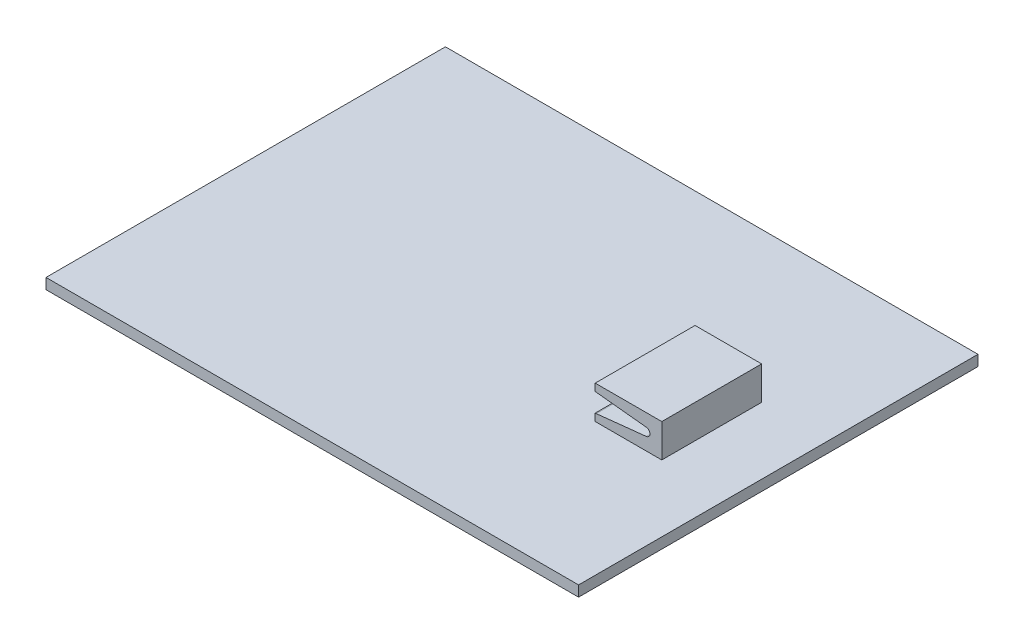
ISO-10303-21;
HEADER;
FILE_DESCRIPTION(('STEP AP214'),'2;1');
FILE_NAME('part.step','',(''),(''),'','','');
FILE_SCHEMA(('AUTOMOTIVE_DESIGN { 1 0 10303 214 1 1 1 1 }'));
ENDSEC;
DATA;
#1=APPLICATION_CONTEXT('core data for automotive mechanical design processes');
#2=APPLICATION_PROTOCOL_DEFINITION('international standard','automotive_design',2000,#1);
#3=PRODUCT_CONTEXT('',#1,'mechanical');
#4=PRODUCT('Part','Part','',(#3));
#5=PRODUCT_RELATED_PRODUCT_CATEGORY('part','',(#4));
#6=PRODUCT_DEFINITION_FORMATION('','',#4);
#7=PRODUCT_DEFINITION_CONTEXT('part definition',#1,'design');
#8=PRODUCT_DEFINITION('design','',#6,#7);
#9=PRODUCT_DEFINITION_SHAPE('','',#8);
#10=(LENGTH_UNIT() NAMED_UNIT(*) SI_UNIT(.MILLI.,.METRE.));
#11=(NAMED_UNIT(*) PLANE_ANGLE_UNIT() SI_UNIT($,.RADIAN.));
#12=(NAMED_UNIT(*) SI_UNIT($,.STERADIAN.) SOLID_ANGLE_UNIT());
#13=UNCERTAINTY_MEASURE_WITH_UNIT(LENGTH_MEASURE(1.E-05),#10,'distance_accuracy_value','');
#14=(GEOMETRIC_REPRESENTATION_CONTEXT(3) GLOBAL_UNCERTAINTY_ASSIGNED_CONTEXT((#13)) GLOBAL_UNIT_ASSIGNED_CONTEXT((#10,
#11,#12)) REPRESENTATION_CONTEXT('',''));
#15=CARTESIAN_POINT('',(0.,0.,0.));
#16=DIRECTION('',(0.,0.,1.));
#17=DIRECTION('',(1.,0.,0.));
#18=AXIS2_PLACEMENT_3D('',#15,#16,#17);
#19=CARTESIAN_POINT('',(200.,66.,-74.9999999999999));
#20=DIRECTION('',(1.,0.,0.));
#21=DIRECTION('',(0.,0.,-1.));
#22=AXIS2_PLACEMENT_3D('',#19,#20,#21);
#23=PLANE('',#22);
#24=DIRECTION('',(0.,-1.,0.));
#25=VECTOR('',#24,1.);
#26=CARTESIAN_POINT('',(200.,66.,75.0000000000001));
#27=LINE('',#26,#25);
#28=CARTESIAN_POINT('',(200.,27.,75.0000000000001));
#29=VERTEX_POINT('',#28);
#30=CARTESIAN_POINT('',(200.,16.,75.0000000000001));
#31=VERTEX_POINT('',#30);
#32=EDGE_CURVE('E66',#29,#31,#27,.T.);
#33=ORIENTED_EDGE('',*,*,#32,.F.);
#34=DIRECTION('',(0.,0.,-1.));
#35=VECTOR('',#34,1.);
#36=CARTESIAN_POINT('',(200.,27.,300.));
#37=LINE('',#36,#35);
#38=CARTESIAN_POINT('',(200.,27.,-74.9999999999999));
#39=VERTEX_POINT('',#38);
#40=EDGE_CURVE('E167',#29,#39,#37,.T.);
#41=ORIENTED_EDGE('',*,*,#40,.T.);
#42=DIRECTION('',(0.,-1.,0.));
#43=VECTOR('',#42,1.);
#44=CARTESIAN_POINT('',(200.,66.,-74.9999999999999));
#45=LINE('',#44,#43);
#46=CARTESIAN_POINT('',(200.,16.,-74.9999999999999));
#47=VERTEX_POINT('',#46);
#48=EDGE_CURVE('E165',#39,#47,#45,.T.);
#49=ORIENTED_EDGE('',*,*,#48,.T.);
#50=DIRECTION('',(0.,0.,1.));
#51=VECTOR('',#50,1.);
#52=CARTESIAN_POINT('',(200.,16.,-74.9999999999999));
#53=LINE('',#52,#51);
#54=EDGE_CURVE('E211',#47,#31,#53,.T.);
#55=ORIENTED_EDGE('',*,*,#54,.T.);
#56=EDGE_LOOP('',(#33,#41,#49,#55));
#57=FACE_BOUND('',#56,.T.);
#58=ADVANCED_FACE('F41',(#57),#23,.F.);
#59=CARTESIAN_POINT('',(0.,16.,0.));
#60=DIRECTION('',(0.,1.,0.));
#61=DIRECTION('',(0.,0.,1.));
#62=AXIS2_PLACEMENT_3D('',#59,#60,#61);
#63=PLANE('',#62);
#64=DIRECTION('',(1.,0.,0.));
#65=VECTOR('',#64,1.);
#66=CARTESIAN_POINT('',(-400.,16.,300.));
#67=LINE('',#66,#65);
#68=CARTESIAN_POINT('',(-400.,16.,300.));
#69=VERTEX_POINT('',#68);
#70=CARTESIAN_POINT('',(400.,16.,300.));
#71=VERTEX_POINT('',#70);
#72=EDGE_CURVE('E223',#69,#71,#67,.T.);
#73=ORIENTED_EDGE('',*,*,#72,.T.);
#74=DIRECTION('',(0.,0.,-1.));
#75=VECTOR('',#74,1.);
#76=CARTESIAN_POINT('',(400.,16.,300.));
#77=LINE('',#76,#75);
#78=CARTESIAN_POINT('',(400.,16.,-300.));
#79=VERTEX_POINT('',#78);
#80=EDGE_CURVE('E226',#71,#79,#77,.T.);
#81=ORIENTED_EDGE('',*,*,#80,.T.);
#82=DIRECTION('',(1.,0.,0.));
#83=VECTOR('',#82,1.);
#84=CARTESIAN_POINT('',(-400.,16.,-300.));
#85=LINE('',#84,#83);
#86=CARTESIAN_POINT('',(-400.,16.,-300.));
#87=VERTEX_POINT('',#86);
#88=EDGE_CURVE('E229',#87,#79,#85,.T.);
#89=ORIENTED_EDGE('',*,*,#88,.F.);
#90=DIRECTION('',(0.,0.,-1.));
#91=VECTOR('',#90,1.);
#92=CARTESIAN_POINT('',(-400.,16.,300.));
#93=LINE('',#92,#91);
#94=EDGE_CURVE('E232',#69,#87,#93,.T.);
#95=ORIENTED_EDGE('',*,*,#94,.F.);
#96=EDGE_LOOP('',(#73,#81,#89,#95));
#97=FACE_BOUND('',#96,.T.);
#98=DIRECTION('',(-1.,0.,0.));
#99=VECTOR('',#98,1.);
#100=CARTESIAN_POINT('',(200.,16.,-74.9999999999999));
#101=LINE('',#100,#99);
#102=CARTESIAN_POINT('',(300.,16.,-74.9999999999999));
#103=VERTEX_POINT('',#102);
#104=EDGE_CURVE('E196',#103,#47,#101,.T.);
#105=ORIENTED_EDGE('',*,*,#104,.F.);
#106=DIRECTION('',(0.,0.,-1.));
#107=VECTOR('',#106,1.);
#108=CARTESIAN_POINT('',(300.,16.,-74.9999999999999));
#109=LINE('',#108,#107);
#110=CARTESIAN_POINT('',(300.,16.,75.0000000000001));
#111=VERTEX_POINT('',#110);
#112=EDGE_CURVE('E193',#111,#103,#109,.T.);
#113=ORIENTED_EDGE('',*,*,#112,.F.);
#114=DIRECTION('',(1.,0.,0.));
#115=VECTOR('',#114,1.);
#116=CARTESIAN_POINT('',(200.,16.,75.0000000000001));
#117=LINE('',#116,#115);
#118=EDGE_CURVE('E203',#31,#111,#117,.T.);
#119=ORIENTED_EDGE('',*,*,#118,.F.);
#120=ORIENTED_EDGE('',*,*,#54,.F.);
#121=EDGE_LOOP('',(#105,#113,#119,#120));
#122=FACE_BOUND('',#121,.T.);
#123=ADVANCED_FACE('F269',(#97,#122),#63,.T.);
#124=CARTESIAN_POINT('',(-400.,16.,300.));
#125=DIRECTION('',(0.,0.,-1.));
#126=DIRECTION('',(-1.,0.,0.));
#127=AXIS2_PLACEMENT_3D('',#124,#125,#126);
#128=PLANE('',#127);
#129=DIRECTION('',(1.,0.,0.));
#130=VECTOR('',#129,1.);
#131=CARTESIAN_POINT('',(-400.,0.,300.));
#132=LINE('',#131,#130);
#133=CARTESIAN_POINT('',(-400.,0.,300.));
#134=VERTEX_POINT('',#133);
#135=CARTESIAN_POINT('',(400.,0.,300.));
#136=VERTEX_POINT('',#135);
#137=EDGE_CURVE('E222',#134,#136,#132,.T.);
#138=ORIENTED_EDGE('',*,*,#137,.T.);
#139=DIRECTION('',(0.,-1.,0.));
#140=VECTOR('',#139,1.);
#141=CARTESIAN_POINT('',(400.,16.,300.));
#142=LINE('',#141,#140);
#143=EDGE_CURVE('E251',#71,#136,#142,.T.);
#144=ORIENTED_EDGE('',*,*,#143,.F.);
#145=ORIENTED_EDGE('',*,*,#72,.F.);
#146=DIRECTION('',(0.,-1.,0.));
#147=VECTOR('',#146,1.);
#148=CARTESIAN_POINT('',(-400.,16.,300.));
#149=LINE('',#148,#147);
#150=EDGE_CURVE('E235',#69,#134,#149,.T.);
#151=ORIENTED_EDGE('',*,*,#150,.T.);
#152=EDGE_LOOP('',(#138,#144,#145,#151));
#153=FACE_BOUND('',#152,.T.);
#154=ADVANCED_FACE('F43',(#153),#128,.F.);
#155=CARTESIAN_POINT('',(400.,16.,300.));
#156=DIRECTION('',(-1.,0.,0.));
#157=DIRECTION('',(0.,0.,1.));
#158=AXIS2_PLACEMENT_3D('',#155,#156,#157);
#159=PLANE('',#158);
#160=DIRECTION('',(0.,0.,-1.));
#161=VECTOR('',#160,1.);
#162=CARTESIAN_POINT('',(400.,0.,300.));
#163=LINE('',#162,#161);
#164=CARTESIAN_POINT('',(400.,0.,-300.));
#165=VERTEX_POINT('',#164);
#166=EDGE_CURVE('E238',#136,#165,#163,.T.);
#167=ORIENTED_EDGE('',*,*,#166,.T.);
#168=DIRECTION('',(0.,-1.,0.));
#169=VECTOR('',#168,1.);
#170=CARTESIAN_POINT('',(400.,16.,-300.));
#171=LINE('',#170,#169);
#172=EDGE_CURVE('E249',#79,#165,#171,.T.);
#173=ORIENTED_EDGE('',*,*,#172,.F.);
#174=ORIENTED_EDGE('',*,*,#80,.F.);
#175=ORIENTED_EDGE('',*,*,#143,.T.);
#176=EDGE_LOOP('',(#167,#173,#174,#175));
#177=FACE_BOUND('',#176,.T.);
#178=ADVANCED_FACE('F315',(#177),#159,.F.);
#179=CARTESIAN_POINT('',(-400.,16.,-300.));
#180=DIRECTION('',(0.,0.,-1.));
#181=DIRECTION('',(-1.,0.,0.));
#182=AXIS2_PLACEMENT_3D('',#179,#180,#181);
#183=PLANE('',#182);
#184=DIRECTION('',(1.,0.,0.));
#185=VECTOR('',#184,1.);
#186=CARTESIAN_POINT('',(-400.,0.,-300.));
#187=LINE('',#186,#185);
#188=CARTESIAN_POINT('',(-400.,0.,-300.));
#189=VERTEX_POINT('',#188);
#190=EDGE_CURVE('E241',#189,#165,#187,.T.);
#191=ORIENTED_EDGE('',*,*,#190,.F.);
#192=DIRECTION('',(0.,-1.,0.));
#193=VECTOR('',#192,1.);
#194=CARTESIAN_POINT('',(-400.,16.,-300.));
#195=LINE('',#194,#193);
#196=EDGE_CURVE('E247',#87,#189,#195,.T.);
#197=ORIENTED_EDGE('',*,*,#196,.F.);
#198=ORIENTED_EDGE('',*,*,#88,.T.);
#199=ORIENTED_EDGE('',*,*,#172,.T.);
#200=EDGE_LOOP('',(#191,#197,#198,#199));
#201=FACE_BOUND('',#200,.T.);
#202=ADVANCED_FACE('F312',(#201),#183,.T.);
#203=CARTESIAN_POINT('',(-400.,16.,300.));
#204=DIRECTION('',(-1.,0.,0.));
#205=DIRECTION('',(0.,0.,1.));
#206=AXIS2_PLACEMENT_3D('',#203,#204,#205);
#207=PLANE('',#206);
#208=DIRECTION('',(0.,0.,-1.));
#209=VECTOR('',#208,1.);
#210=CARTESIAN_POINT('',(-400.,0.,300.));
#211=LINE('',#210,#209);
#212=EDGE_CURVE('E227',#134,#189,#211,.T.);
#213=ORIENTED_EDGE('',*,*,#212,.F.);
#214=ORIENTED_EDGE('',*,*,#150,.F.);
#215=ORIENTED_EDGE('',*,*,#94,.T.);
#216=ORIENTED_EDGE('',*,*,#196,.T.);
#217=EDGE_LOOP('',(#213,#214,#215,#216));
#218=FACE_BOUND('',#217,.T.);
#219=ADVANCED_FACE('F306',(#218),#207,.T.);
#220=CARTESIAN_POINT('',(0.,0.,0.));
#221=DIRECTION('',(0.,1.,0.));
#222=DIRECTION('',(0.,0.,1.));
#223=AXIS2_PLACEMENT_3D('',#220,#221,#222);
#224=PLANE('',#223);
#225=ORIENTED_EDGE('',*,*,#137,.F.);
#226=ORIENTED_EDGE('',*,*,#212,.T.);
#227=ORIENTED_EDGE('',*,*,#190,.T.);
#228=ORIENTED_EDGE('',*,*,#166,.F.);
#229=EDGE_LOOP('',(#225,#226,#227,#228));
#230=FACE_BOUND('',#229,.T.);
#231=ADVANCED_FACE('F301',(#230),#224,.F.);
#232=CARTESIAN_POINT('',(300.,66.,-74.9999999999999));
#233=DIRECTION('',(-1.,0.,0.));
#234=DIRECTION('',(0.,0.,1.));
#235=AXIS2_PLACEMENT_3D('',#232,#233,#234);
#236=PLANE('',#235);
#237=ORIENTED_EDGE('',*,*,#112,.T.);
#238=DIRECTION('',(0.,-1.,0.));
#239=VECTOR('',#238,1.);
#240=CARTESIAN_POINT('',(300.,66.,-74.9999999999999));
#241=LINE('',#240,#239);
#242=CARTESIAN_POINT('',(300.,66.,-74.9999999999999));
#243=VERTEX_POINT('',#242);
#244=EDGE_CURVE('E220',#243,#103,#241,.T.);
#245=ORIENTED_EDGE('',*,*,#244,.F.);
#246=DIRECTION('',(0.,0.,-1.));
#247=VECTOR('',#246,1.);
#248=CARTESIAN_POINT('',(300.,66.,-74.9999999999999));
#249=LINE('',#248,#247);
#250=CARTESIAN_POINT('',(300.,66.,75.0000000000001));
#251=VERTEX_POINT('',#250);
#252=EDGE_CURVE('E199',#251,#243,#249,.T.);
#253=ORIENTED_EDGE('',*,*,#252,.F.);
#254=DIRECTION('',(0.,-1.,0.));
#255=VECTOR('',#254,1.);
#256=CARTESIAN_POINT('',(300.,66.,75.0000000000001));
#257=LINE('',#256,#255);
#258=EDGE_CURVE('E208',#251,#111,#257,.T.);
#259=ORIENTED_EDGE('',*,*,#258,.T.);
#260=EDGE_LOOP('',(#237,#245,#253,#259));
#261=FACE_BOUND('',#260,.T.);
#262=ADVANCED_FACE('F287',(#261),#236,.F.);
#263=CARTESIAN_POINT('',(200.,66.,-74.9999999999999));
#264=DIRECTION('',(0.,0.,1.));
#265=DIRECTION('',(1.,0.,0.));
#266=AXIS2_PLACEMENT_3D('',#263,#264,#265);
#267=PLANE('',#266);
#268=DIRECTION('',(-0.99447845113102,0.104940984539154,0.));
#269=VECTOR('',#268,1.);
#270=CARTESIAN_POINT('',(198.860135089431,55.1980135717355,-74.9999999999999));
#271=LINE('',#270,#269);
#272=CARTESIAN_POINT('',(276.862969190143,46.9668707067861,-74.9999999999998));
#273=VERTEX_POINT('',#272);
#274=CARTESIAN_POINT('',(201.469173783548,54.9226983158343,-74.9999999999998));
#275=VERTEX_POINT('',#274);
#276=EDGE_CURVE('E166',#273,#275,#271,.T.);
#277=ORIENTED_EDGE('',*,*,#276,.T.);
#278=CARTESIAN_POINT('',(200.,41.,-74.9999999999998));
#279=DIRECTION('',(0.,0.,1.));
#280=DIRECTION('',(1.,0.,0.));
#281=AXIS2_PLACEMENT_3D('',#278,#279,#280);
#282=CIRCLE('',#281,14.);
#283=CARTESIAN_POINT('',(200.,55.,-74.9999999999999));
#284=VERTEX_POINT('',#283);
#285=EDGE_CURVE('E169',#275,#284,#282,.T.);
#286=ORIENTED_EDGE('',*,*,#285,.T.);
#287=CARTESIAN_POINT('',(200.,66.,-74.9999999999999));
#288=VERTEX_POINT('',#287);
#289=EDGE_CURVE('E218',#288,#284,#45,.T.);
#290=ORIENTED_EDGE('',*,*,#289,.F.);
#291=DIRECTION('',(-1.,0.,0.));
#292=VECTOR('',#291,1.);
#293=CARTESIAN_POINT('',(200.,66.,-74.9999999999999));
#294=LINE('',#293,#292);
#295=EDGE_CURVE('E202',#243,#288,#294,.T.);
#296=ORIENTED_EDGE('',*,*,#295,.F.);
#297=ORIENTED_EDGE('',*,*,#244,.T.);
#298=ORIENTED_EDGE('',*,*,#104,.T.);
#299=ORIENTED_EDGE('',*,*,#48,.F.);
#300=CARTESIAN_POINT('',(201.469173783548,27.0773016841657,-74.9999999999998));
#301=VERTEX_POINT('',#300);
#302=EDGE_CURVE('E156',#39,#301,#282,.T.);
#303=ORIENTED_EDGE('',*,*,#302,.T.);
#304=DIRECTION('',(0.99447845113102,0.104940984539154,0.));
#305=VECTOR('',#304,1.);
#306=CARTESIAN_POINT('',(204.078212477664,27.3526169400669,-74.9999999999999));
#307=LINE('',#306,#305);
#308=CARTESIAN_POINT('',(276.862969190143,35.0331292932139,-74.9999999999998));
#309=VERTEX_POINT('',#308);
#310=EDGE_CURVE('E144',#301,#309,#307,.T.);
#311=ORIENTED_EDGE('',*,*,#310,.T.);
#312=CARTESIAN_POINT('',(276.233323282908,41.,-74.9999999999998));
#313=DIRECTION('',(0.,0.,1.));
#314=DIRECTION('',(1.,0.,0.));
#315=AXIS2_PLACEMENT_3D('',#312,#313,#314);
#316=CIRCLE('',#315,5.99999999999999);
#317=EDGE_CURVE('E170',#309,#273,#316,.T.);
#318=ORIENTED_EDGE('',*,*,#317,.T.);
#319=EDGE_LOOP('',(#277,#286,#290,#296,#297,#298,#299,#303,#311,#318));
#320=FACE_BOUND('',#319,.T.);
#321=ADVANCED_FACE('F163',(#320),#267,.F.);
#322=ORIENTED_EDGE('',*,*,#289,.T.);
#323=DIRECTION('',(0.,0.,-1.));
#324=VECTOR('',#323,1.);
#325=CARTESIAN_POINT('',(200.,55.,300.));
#326=LINE('',#325,#324);
#327=CARTESIAN_POINT('',(200.,55.,75.0000000000001));
#328=VERTEX_POINT('',#327);
#329=EDGE_CURVE('E151',#284,#328,#326,.F.);
#330=ORIENTED_EDGE('',*,*,#329,.T.);
#331=CARTESIAN_POINT('',(200.,66.,75.0000000000001));
#332=VERTEX_POINT('',#331);
#333=EDGE_CURVE('E216',#332,#328,#27,.T.);
#334=ORIENTED_EDGE('',*,*,#333,.F.);
#335=DIRECTION('',(0.,0.,1.));
#336=VECTOR('',#335,1.);
#337=CARTESIAN_POINT('',(200.,66.,-74.9999999999999));
#338=LINE('',#337,#336);
#339=EDGE_CURVE('E205',#288,#332,#338,.T.);
#340=ORIENTED_EDGE('',*,*,#339,.F.);
#341=EDGE_LOOP('',(#322,#330,#334,#340));
#342=FACE_BOUND('',#341,.T.);
#343=ADVANCED_FACE('F272',(#342),#23,.F.);
#344=CARTESIAN_POINT('',(200.,66.,75.0000000000001));
#345=DIRECTION('',(0.,0.,-1.));
#346=DIRECTION('',(-1.,0.,0.));
#347=AXIS2_PLACEMENT_3D('',#344,#345,#346);
#348=PLANE('',#347);
#349=ORIENTED_EDGE('',*,*,#333,.T.);
#350=CARTESIAN_POINT('',(200.,41.,75.0000000000001));
#351=DIRECTION('',(0.,0.,-1.));
#352=DIRECTION('',(-1.,0.,0.));
#353=AXIS2_PLACEMENT_3D('',#350,#351,#352);
#354=CIRCLE('',#353,14.);
#355=CARTESIAN_POINT('',(201.469173783548,54.9226983158343,75.0000000000001));
#356=VERTEX_POINT('',#355);
#357=EDGE_CURVE('E11',#328,#356,#354,.T.);
#358=ORIENTED_EDGE('',*,*,#357,.T.);
#359=DIRECTION('',(0.99447845113102,-0.104940984539154,0.));
#360=VECTOR('',#359,1.);
#361=CARTESIAN_POINT('',(198.860135089431,55.1980135717354,75.0000000000001));
#362=LINE('',#361,#360);
#363=CARTESIAN_POINT('',(276.862969190143,46.9668707067861,75.0000000000001));
#364=VERTEX_POINT('',#363);
#365=EDGE_CURVE('E45',#356,#364,#362,.T.);
#366=ORIENTED_EDGE('',*,*,#365,.T.);
#367=CARTESIAN_POINT('',(276.233323282908,41.,75.0000000000001));
#368=DIRECTION('',(0.,0.,-1.));
#369=DIRECTION('',(-1.,0.,0.));
#370=AXIS2_PLACEMENT_3D('',#367,#368,#369);
#371=CIRCLE('',#370,5.99999999999999);
#372=CARTESIAN_POINT('',(276.862969190143,35.0331292932139,75.0000000000001));
#373=VERTEX_POINT('',#372);
#374=EDGE_CURVE('E190',#364,#373,#371,.T.);
#375=ORIENTED_EDGE('',*,*,#374,.T.);
#376=DIRECTION('',(-0.99447845113102,-0.104940984539154,0.));
#377=VECTOR('',#376,1.);
#378=CARTESIAN_POINT('',(204.078212477664,27.3526169400669,75.0000000000001));
#379=LINE('',#378,#377);
#380=CARTESIAN_POINT('',(201.469173783548,27.0773016841657,75.0000000000001));
#381=VERTEX_POINT('',#380);
#382=EDGE_CURVE('E254',#373,#381,#379,.T.);
#383=ORIENTED_EDGE('',*,*,#382,.T.);
#384=EDGE_CURVE('E51',#381,#29,#354,.T.);
#385=ORIENTED_EDGE('',*,*,#384,.T.);
#386=ORIENTED_EDGE('',*,*,#32,.T.);
#387=ORIENTED_EDGE('',*,*,#118,.T.);
#388=ORIENTED_EDGE('',*,*,#258,.F.);
#389=DIRECTION('',(1.,0.,0.));
#390=VECTOR('',#389,1.);
#391=CARTESIAN_POINT('',(200.,66.,75.0000000000001));
#392=LINE('',#391,#390);
#393=EDGE_CURVE('E207',#332,#251,#392,.T.);
#394=ORIENTED_EDGE('',*,*,#393,.F.);
#395=EDGE_LOOP('',(#349,#358,#366,#375,#383,#385,#386,#387,#388,#394));
#396=FACE_BOUND('',#395,.T.);
#397=ADVANCED_FACE('F255',(#396),#348,.F.);
#398=CARTESIAN_POINT('',(0.,66.,0.));
#399=DIRECTION('',(0.,1.,0.));
#400=DIRECTION('',(0.,0.,1.));
#401=AXIS2_PLACEMENT_3D('',#398,#399,#400);
#402=PLANE('',#401);
#403=ORIENTED_EDGE('',*,*,#252,.T.);
#404=ORIENTED_EDGE('',*,*,#295,.T.);
#405=ORIENTED_EDGE('',*,*,#339,.T.);
#406=ORIENTED_EDGE('',*,*,#393,.T.);
#407=EDGE_LOOP('',(#403,#404,#405,#406));
#408=FACE_BOUND('',#407,.T.);
#409=ADVANCED_FACE('F286',(#408),#402,.T.);
#410=CARTESIAN_POINT('',(276.233323282908,41.,300.));
#411=DIRECTION('',(0.,0.,-1.));
#412=DIRECTION('',(-1.,0.,0.));
#413=AXIS2_PLACEMENT_3D('',#410,#411,#412);
#414=CYLINDRICAL_SURFACE('',#413,5.99999999999999);
#415=DIRECTION('',(0.,0.,-1.));
#416=VECTOR('',#415,1.);
#417=CARTESIAN_POINT('',(276.862969190143,35.0331292932139,300.));
#418=LINE('',#417,#416);
#419=EDGE_CURVE('E147',#373,#309,#418,.T.);
#420=ORIENTED_EDGE('',*,*,#419,.F.);
#421=ORIENTED_EDGE('',*,*,#374,.F.);
#422=DIRECTION('',(0.,0.,-1.));
#423=VECTOR('',#422,1.);
#424=CARTESIAN_POINT('',(276.862969190143,46.9668707067861,300.));
#425=LINE('',#424,#423);
#426=EDGE_CURVE('E152',#364,#273,#425,.T.);
#427=ORIENTED_EDGE('',*,*,#426,.T.);
#428=ORIENTED_EDGE('',*,*,#317,.F.);
#429=EDGE_LOOP('',(#420,#421,#427,#428));
#430=FACE_BOUND('',#429,.T.);
#431=ADVANCED_FACE('F188',(#430),#414,.F.);
#432=CARTESIAN_POINT('',(276.862969190143,46.9668707067861,300.));
#433=DIRECTION('',(0.104940984539154,0.99447845113102,0.));
#434=DIRECTION('',(-0.99447845113102,0.104940984539154,0.));
#435=AXIS2_PLACEMENT_3D('',#432,#433,#434);
#436=PLANE('',#435);
#437=ORIENTED_EDGE('',*,*,#426,.F.);
#438=ORIENTED_EDGE('',*,*,#365,.F.);
#439=DIRECTION('',(0.,0.,-1.));
#440=VECTOR('',#439,1.);
#441=CARTESIAN_POINT('',(201.469173783548,54.9226983158343,300.));
#442=LINE('',#441,#440);
#443=EDGE_CURVE('E159',#356,#275,#442,.T.);
#444=ORIENTED_EDGE('',*,*,#443,.T.);
#445=ORIENTED_EDGE('',*,*,#276,.F.);
#446=EDGE_LOOP('',(#437,#438,#444,#445));
#447=FACE_BOUND('',#446,.T.);
#448=ADVANCED_FACE('F257',(#447),#436,.F.);
#449=CARTESIAN_POINT('',(200.,41.,300.));
#450=DIRECTION('',(0.,0.,-1.));
#451=DIRECTION('',(-1.,0.,0.));
#452=AXIS2_PLACEMENT_3D('',#449,#450,#451);
#453=CYLINDRICAL_SURFACE('',#452,14.);
#454=ORIENTED_EDGE('',*,*,#40,.F.);
#455=ORIENTED_EDGE('',*,*,#384,.F.);
#456=DIRECTION('',(0.,0.,-1.));
#457=VECTOR('',#456,1.);
#458=CARTESIAN_POINT('',(201.469173783548,27.0773016841657,300.));
#459=LINE('',#458,#457);
#460=EDGE_CURVE('E58',#381,#301,#459,.T.);
#461=ORIENTED_EDGE('',*,*,#460,.T.);
#462=ORIENTED_EDGE('',*,*,#302,.F.);
#463=EDGE_LOOP('',(#454,#455,#461,#462));
#464=FACE_BOUND('',#463,.T.);
#465=ADVANCED_FACE('F155',(#464),#453,.F.);
#466=ORIENTED_EDGE('',*,*,#443,.F.);
#467=ORIENTED_EDGE('',*,*,#357,.F.);
#468=ORIENTED_EDGE('',*,*,#329,.F.);
#469=ORIENTED_EDGE('',*,*,#285,.F.);
#470=EDGE_LOOP('',(#466,#467,#468,#469));
#471=FACE_BOUND('',#470,.T.);
#472=ADVANCED_FACE('F259',(#471),#453,.F.);
#473=CARTESIAN_POINT('',(276.862969190143,35.0331292932139,300.));
#474=DIRECTION('',(0.104940984539154,-0.99447845113102,0.));
#475=DIRECTION('',(0.99447845113102,0.104940984539154,0.));
#476=AXIS2_PLACEMENT_3D('',#473,#474,#475);
#477=PLANE('',#476);
#478=ORIENTED_EDGE('',*,*,#460,.F.);
#479=ORIENTED_EDGE('',*,*,#382,.F.);
#480=ORIENTED_EDGE('',*,*,#419,.T.);
#481=ORIENTED_EDGE('',*,*,#310,.F.);
#482=EDGE_LOOP('',(#478,#479,#480,#481));
#483=FACE_BOUND('',#482,.T.);
#484=ADVANCED_FACE('F145',(#483),#477,.F.);
#485=CLOSED_SHELL('',(#58,#123,#154,#178,#202,#219,#231,#262,#321,#343,#397,#409,#431,#448,#465,
#472,#484));
#486=MANIFOLD_SOLID_BREP('B2',#485);
#487=ADVANCED_BREP_SHAPE_REPRESENTATION('',(#18,#486),#14);
#488=SHAPE_DEFINITION_REPRESENTATION(#9,#487);
ENDSEC;
END-ISO-10303-21;
